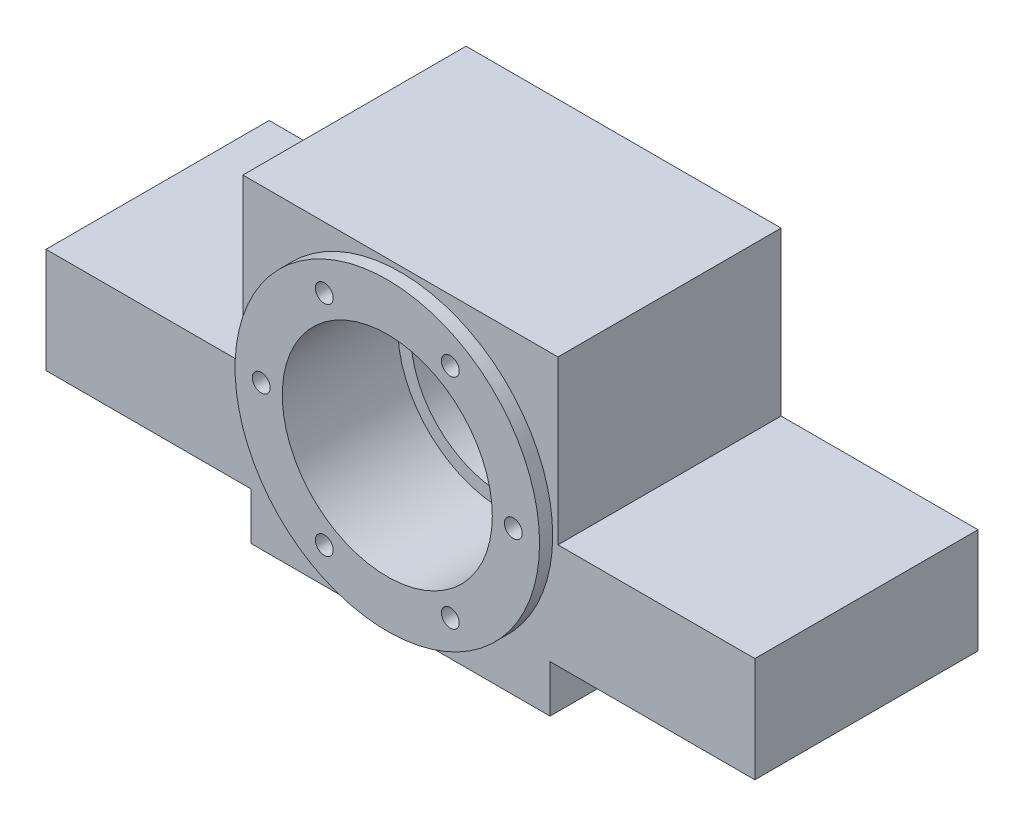
ISO-10303-21;
HEADER;
FILE_DESCRIPTION(('STEP AP214'),'2;1');
FILE_NAME('part.step','',(''),(''),'','','');
FILE_SCHEMA(('AUTOMOTIVE_DESIGN { 1 0 10303 214 1 1 1 1 }'));
ENDSEC;
DATA;
#1=APPLICATION_CONTEXT('core data for automotive mechanical design processes');
#2=APPLICATION_PROTOCOL_DEFINITION('international standard','automotive_design',2000,#1);
#3=PRODUCT_CONTEXT('',#1,'mechanical');
#4=PRODUCT('Part','Part','',(#3));
#5=PRODUCT_RELATED_PRODUCT_CATEGORY('part','',(#4));
#6=PRODUCT_DEFINITION_FORMATION('','',#4);
#7=PRODUCT_DEFINITION_CONTEXT('part definition',#1,'design');
#8=PRODUCT_DEFINITION('design','',#6,#7);
#9=PRODUCT_DEFINITION_SHAPE('','',#8);
#10=(LENGTH_UNIT() NAMED_UNIT(*) SI_UNIT(.MILLI.,.METRE.));
#11=(NAMED_UNIT(*) PLANE_ANGLE_UNIT() SI_UNIT($,.RADIAN.));
#12=(NAMED_UNIT(*) SI_UNIT($,.STERADIAN.) SOLID_ANGLE_UNIT());
#13=UNCERTAINTY_MEASURE_WITH_UNIT(LENGTH_MEASURE(1.E-05),#10,'distance_accuracy_value','');
#14=(GEOMETRIC_REPRESENTATION_CONTEXT(3) GLOBAL_UNCERTAINTY_ASSIGNED_CONTEXT((#13)) GLOBAL_UNIT_ASSIGNED_CONTEXT((#10,
#11,#12)) REPRESENTATION_CONTEXT('',''));
#15=CARTESIAN_POINT('',(0.,0.,0.));
#16=DIRECTION('',(0.,0.,1.));
#17=DIRECTION('',(1.,0.,0.));
#18=AXIS2_PLACEMENT_3D('',#15,#16,#17);
#19=CARTESIAN_POINT('',(60.,120.,-85.));
#20=DIRECTION('',(1.,0.,0.));
#21=DIRECTION('',(0.,1.,0.));
#22=AXIS2_PLACEMENT_3D('',#19,#20,#21);
#23=PLANE('',#22);
#24=DIRECTION('',(0.,1.,0.));
#25=VECTOR('',#24,1.);
#26=CARTESIAN_POINT('',(60.,120.,0.));
#27=LINE('',#26,#25);
#28=CARTESIAN_POINT('',(60.,58.,0.));
#29=VERTEX_POINT('',#28);
#30=CARTESIAN_POINT('',(60.,120.,0.));
#31=VERTEX_POINT('',#30);
#32=EDGE_CURVE('E171',#29,#31,#27,.T.);
#33=ORIENTED_EDGE('',*,*,#32,.F.);
#34=DIRECTION('',(0.,0.,1.));
#35=VECTOR('',#34,1.);
#36=CARTESIAN_POINT('',(60.,58.,-85.));
#37=LINE('',#36,#35);
#38=CARTESIAN_POINT('',(60.,58.,-85.));
#39=VERTEX_POINT('',#38);
#40=EDGE_CURVE('E54',#39,#29,#37,.T.);
#41=ORIENTED_EDGE('',*,*,#40,.F.);
#42=DIRECTION('',(0.,1.,0.));
#43=VECTOR('',#42,1.);
#44=CARTESIAN_POINT('',(60.,120.,-85.));
#45=LINE('',#44,#43);
#46=CARTESIAN_POINT('',(60.,120.,-85.));
#47=VERTEX_POINT('',#46);
#48=EDGE_CURVE('E205',#39,#47,#45,.T.);
#49=ORIENTED_EDGE('',*,*,#48,.T.);
#50=DIRECTION('',(0.,0.,1.));
#51=VECTOR('',#50,1.);
#52=CARTESIAN_POINT('',(60.,120.,-85.));
#53=LINE('',#52,#51);
#54=EDGE_CURVE('E48',#47,#31,#53,.T.);
#55=ORIENTED_EDGE('',*,*,#54,.T.);
#56=EDGE_LOOP('',(#33,#41,#49,#55));
#57=FACE_BOUND('',#56,.T.);
#58=ADVANCED_FACE('F45',(#57),#23,.T.);
#59=CARTESIAN_POINT('',(60.,58.,-85.));
#60=DIRECTION('',(0.,1.,0.));
#61=DIRECTION('',(-1.,0.,0.));
#62=AXIS2_PLACEMENT_3D('',#59,#60,#61);
#63=PLANE('',#62);
#64=DIRECTION('',(-1.,0.,0.));
#65=VECTOR('',#64,1.);
#66=CARTESIAN_POINT('',(60.,58.,0.));
#67=LINE('',#66,#65);
#68=CARTESIAN_POINT('',(135.,58.,0.));
#69=VERTEX_POINT('',#68);
#70=EDGE_CURVE('E202',#69,#29,#67,.T.);
#71=ORIENTED_EDGE('',*,*,#70,.F.);
#72=DIRECTION('',(0.,0.,1.));
#73=VECTOR('',#72,1.);
#74=CARTESIAN_POINT('',(135.,58.,-85.));
#75=LINE('',#74,#73);
#76=CARTESIAN_POINT('',(135.,58.,-85.));
#77=VERTEX_POINT('',#76);
#78=EDGE_CURVE('E104',#77,#69,#75,.T.);
#79=ORIENTED_EDGE('',*,*,#78,.F.);
#80=DIRECTION('',(-1.,0.,0.));
#81=VECTOR('',#80,1.);
#82=CARTESIAN_POINT('',(60.,58.,-85.));
#83=LINE('',#82,#81);
#84=EDGE_CURVE('E161',#77,#39,#83,.T.);
#85=ORIENTED_EDGE('',*,*,#84,.T.);
#86=ORIENTED_EDGE('',*,*,#40,.T.);
#87=EDGE_LOOP('',(#71,#79,#85,#86));
#88=FACE_BOUND('',#87,.T.);
#89=ADVANCED_FACE('F226',(#88),#63,.T.);
#90=CARTESIAN_POINT('',(135.,58.,-85.));
#91=DIRECTION('',(1.,0.,0.));
#92=DIRECTION('',(0.,0.,-1.));
#93=AXIS2_PLACEMENT_3D('',#90,#91,#92);
#94=PLANE('',#93);
#95=DIRECTION('',(0.,1.,0.));
#96=VECTOR('',#95,1.);
#97=CARTESIAN_POINT('',(135.,58.,0.));
#98=LINE('',#97,#96);
#99=CARTESIAN_POINT('',(135.,18.,0.));
#100=VERTEX_POINT('',#99);
#101=EDGE_CURVE('E148',#100,#69,#98,.T.);
#102=ORIENTED_EDGE('',*,*,#101,.F.);
#103=DIRECTION('',(0.,0.,1.));
#104=VECTOR('',#103,1.);
#105=CARTESIAN_POINT('',(135.,18.,-85.));
#106=LINE('',#105,#104);
#107=CARTESIAN_POINT('',(135.,18.,-85.));
#108=VERTEX_POINT('',#107);
#109=EDGE_CURVE('E143',#108,#100,#106,.T.);
#110=ORIENTED_EDGE('',*,*,#109,.F.);
#111=DIRECTION('',(0.,1.,0.));
#112=VECTOR('',#111,1.);
#113=CARTESIAN_POINT('',(135.,58.,-85.));
#114=LINE('',#113,#112);
#115=EDGE_CURVE('E146',#108,#77,#114,.T.);
#116=ORIENTED_EDGE('',*,*,#115,.T.);
#117=ORIENTED_EDGE('',*,*,#78,.T.);
#118=EDGE_LOOP('',(#102,#110,#116,#117));
#119=FACE_BOUND('',#118,.T.);
#120=ADVANCED_FACE('F145',(#119),#94,.T.);
#121=CARTESIAN_POINT('',(57.,18.,-85.));
#122=DIRECTION('',(0.,-1.,0.));
#123=DIRECTION('',(0.,0.,-1.));
#124=AXIS2_PLACEMENT_3D('',#121,#122,#123);
#125=PLANE('',#124);
#126=DIRECTION('',(1.,0.,0.));
#127=VECTOR('',#126,1.);
#128=CARTESIAN_POINT('',(57.,18.,0.));
#129=LINE('',#128,#127);
#130=CARTESIAN_POINT('',(57.,18.,0.));
#131=VERTEX_POINT('',#130);
#132=EDGE_CURVE('E199',#131,#100,#129,.T.);
#133=ORIENTED_EDGE('',*,*,#132,.F.);
#134=DIRECTION('',(0.,0.,1.));
#135=VECTOR('',#134,1.);
#136=CARTESIAN_POINT('',(57.,18.,-85.));
#137=LINE('',#136,#135);
#138=CARTESIAN_POINT('',(57.,18.,-85.));
#139=VERTEX_POINT('',#138);
#140=EDGE_CURVE('E153',#139,#131,#137,.T.);
#141=ORIENTED_EDGE('',*,*,#140,.F.);
#142=DIRECTION('',(1.,0.,0.));
#143=VECTOR('',#142,1.);
#144=CARTESIAN_POINT('',(57.,18.,-85.));
#145=LINE('',#144,#143);
#146=EDGE_CURVE('E159',#139,#108,#145,.T.);
#147=ORIENTED_EDGE('',*,*,#146,.T.);
#148=ORIENTED_EDGE('',*,*,#109,.T.);
#149=EDGE_LOOP('',(#133,#141,#147,#148));
#150=FACE_BOUND('',#149,.T.);
#151=ADVANCED_FACE('F163',(#150),#125,.T.);
#152=CARTESIAN_POINT('',(57.,0.,-85.));
#153=DIRECTION('',(1.,0.,0.));
#154=DIRECTION('',(0.,0.,-1.));
#155=AXIS2_PLACEMENT_3D('',#152,#153,#154);
#156=PLANE('',#155);
#157=DIRECTION('',(0.,1.,0.));
#158=VECTOR('',#157,1.);
#159=CARTESIAN_POINT('',(57.,0.,0.));
#160=LINE('',#159,#158);
#161=CARTESIAN_POINT('',(57.,0.,0.));
#162=VERTEX_POINT('',#161);
#163=EDGE_CURVE('E196',#162,#131,#160,.T.);
#164=ORIENTED_EDGE('',*,*,#163,.F.);
#165=DIRECTION('',(0.,0.,1.));
#166=VECTOR('',#165,1.);
#167=CARTESIAN_POINT('',(57.,0.,-85.));
#168=LINE('',#167,#166);
#169=CARTESIAN_POINT('',(57.,0.,-85.));
#170=VERTEX_POINT('',#169);
#171=EDGE_CURVE('E209',#170,#162,#168,.T.);
#172=ORIENTED_EDGE('',*,*,#171,.F.);
#173=DIRECTION('',(0.,1.,0.));
#174=VECTOR('',#173,1.);
#175=CARTESIAN_POINT('',(57.,0.,-85.));
#176=LINE('',#175,#174);
#177=EDGE_CURVE('E164',#170,#139,#176,.T.);
#178=ORIENTED_EDGE('',*,*,#177,.T.);
#179=ORIENTED_EDGE('',*,*,#140,.T.);
#180=EDGE_LOOP('',(#164,#172,#178,#179));
#181=FACE_BOUND('',#180,.T.);
#182=ADVANCED_FACE('F239',(#181),#156,.T.);
#183=CARTESIAN_POINT('',(0.,0.,-85.));
#184=DIRECTION('',(0.,-1.,0.));
#185=DIRECTION('',(0.,0.,-1.));
#186=AXIS2_PLACEMENT_3D('',#183,#184,#185);
#187=PLANE('',#186);
#188=DIRECTION('',(1.,0.,0.));
#189=VECTOR('',#188,1.);
#190=CARTESIAN_POINT('',(0.,0.,0.));
#191=LINE('',#190,#189);
#192=CARTESIAN_POINT('',(-57.,0.,0.));
#193=VERTEX_POINT('',#192);
#194=EDGE_CURVE('E193',#193,#162,#191,.T.);
#195=ORIENTED_EDGE('',*,*,#194,.F.);
#196=DIRECTION('',(0.,0.,1.));
#197=VECTOR('',#196,1.);
#198=CARTESIAN_POINT('',(-57.,0.,-85.));
#199=LINE('',#198,#197);
#200=CARTESIAN_POINT('',(-57.,0.,-85.));
#201=VERTEX_POINT('',#200);
#202=EDGE_CURVE('E211',#201,#193,#199,.T.);
#203=ORIENTED_EDGE('',*,*,#202,.F.);
#204=DIRECTION('',(1.,0.,0.));
#205=VECTOR('',#204,1.);
#206=CARTESIAN_POINT('',(0.,0.,-85.));
#207=LINE('',#206,#205);
#208=EDGE_CURVE('E166',#201,#170,#207,.T.);
#209=ORIENTED_EDGE('',*,*,#208,.T.);
#210=ORIENTED_EDGE('',*,*,#171,.T.);
#211=EDGE_LOOP('',(#195,#203,#209,#210));
#212=FACE_BOUND('',#211,.T.);
#213=ADVANCED_FACE('F242',(#212),#187,.T.);
#214=CARTESIAN_POINT('',(-57.,0.,-85.));
#215=DIRECTION('',(-1.,0.,0.));
#216=DIRECTION('',(0.,0.,1.));
#217=AXIS2_PLACEMENT_3D('',#214,#215,#216);
#218=PLANE('',#217);
#219=DIRECTION('',(0.,-1.,0.));
#220=VECTOR('',#219,1.);
#221=CARTESIAN_POINT('',(-57.,0.,0.));
#222=LINE('',#221,#220);
#223=CARTESIAN_POINT('',(-57.,18.,0.));
#224=VERTEX_POINT('',#223);
#225=EDGE_CURVE('E190',#224,#193,#222,.T.);
#226=ORIENTED_EDGE('',*,*,#225,.F.);
#227=DIRECTION('',(0.,0.,1.));
#228=VECTOR('',#227,1.);
#229=CARTESIAN_POINT('',(-57.,18.,-85.));
#230=LINE('',#229,#228);
#231=CARTESIAN_POINT('',(-57.,18.,-85.));
#232=VERTEX_POINT('',#231);
#233=EDGE_CURVE('E214',#232,#224,#230,.T.);
#234=ORIENTED_EDGE('',*,*,#233,.F.);
#235=DIRECTION('',(0.,-1.,0.));
#236=VECTOR('',#235,1.);
#237=CARTESIAN_POINT('',(-57.,0.,-85.));
#238=LINE('',#237,#236);
#239=EDGE_CURVE('E414',#232,#201,#238,.T.);
#240=ORIENTED_EDGE('',*,*,#239,.T.);
#241=ORIENTED_EDGE('',*,*,#202,.T.);
#242=EDGE_LOOP('',(#226,#234,#240,#241));
#243=FACE_BOUND('',#242,.T.);
#244=ADVANCED_FACE('F246',(#243),#218,.T.);
#245=CARTESIAN_POINT('',(-57.,18.,-85.));
#246=DIRECTION('',(0.,-1.,0.));
#247=DIRECTION('',(1.,0.,0.));
#248=AXIS2_PLACEMENT_3D('',#245,#246,#247);
#249=PLANE('',#248);
#250=DIRECTION('',(1.,0.,0.));
#251=VECTOR('',#250,1.);
#252=CARTESIAN_POINT('',(-57.,18.,0.));
#253=LINE('',#252,#251);
#254=CARTESIAN_POINT('',(-135.,18.,0.));
#255=VERTEX_POINT('',#254);
#256=EDGE_CURVE('E187',#255,#224,#253,.T.);
#257=ORIENTED_EDGE('',*,*,#256,.F.);
#258=DIRECTION('',(0.,0.,1.));
#259=VECTOR('',#258,1.);
#260=CARTESIAN_POINT('',(-135.,18.,-85.));
#261=LINE('',#260,#259);
#262=CARTESIAN_POINT('',(-135.,18.,-85.));
#263=VERTEX_POINT('',#262);
#264=EDGE_CURVE('E216',#263,#255,#261,.T.);
#265=ORIENTED_EDGE('',*,*,#264,.F.);
#266=DIRECTION('',(1.,0.,0.));
#267=VECTOR('',#266,1.);
#268=CARTESIAN_POINT('',(-57.,18.,-85.));
#269=LINE('',#268,#267);
#270=EDGE_CURVE('E411',#263,#232,#269,.T.);
#271=ORIENTED_EDGE('',*,*,#270,.T.);
#272=ORIENTED_EDGE('',*,*,#233,.T.);
#273=EDGE_LOOP('',(#257,#265,#271,#272));
#274=FACE_BOUND('',#273,.T.);
#275=ADVANCED_FACE('F250',(#274),#249,.T.);
#276=CARTESIAN_POINT('',(-135.,58.,-85.));
#277=DIRECTION('',(-1.,0.,0.));
#278=DIRECTION('',(0.,0.,1.));
#279=AXIS2_PLACEMENT_3D('',#276,#277,#278);
#280=PLANE('',#279);
#281=DIRECTION('',(0.,-1.,0.));
#282=VECTOR('',#281,1.);
#283=CARTESIAN_POINT('',(-135.,58.,0.));
#284=LINE('',#283,#282);
#285=CARTESIAN_POINT('',(-135.,58.,0.));
#286=VERTEX_POINT('',#285);
#287=EDGE_CURVE('E184',#286,#255,#284,.T.);
#288=ORIENTED_EDGE('',*,*,#287,.F.);
#289=DIRECTION('',(0.,0.,1.));
#290=VECTOR('',#289,1.);
#291=CARTESIAN_POINT('',(-135.,58.,-85.));
#292=LINE('',#291,#290);
#293=CARTESIAN_POINT('',(-135.,58.,-85.));
#294=VERTEX_POINT('',#293);
#295=EDGE_CURVE('E218',#294,#286,#292,.T.);
#296=ORIENTED_EDGE('',*,*,#295,.F.);
#297=DIRECTION('',(0.,-1.,0.));
#298=VECTOR('',#297,1.);
#299=CARTESIAN_POINT('',(-135.,58.,-85.));
#300=LINE('',#299,#298);
#301=EDGE_CURVE('E408',#294,#263,#300,.T.);
#302=ORIENTED_EDGE('',*,*,#301,.T.);
#303=ORIENTED_EDGE('',*,*,#264,.T.);
#304=EDGE_LOOP('',(#288,#296,#302,#303));
#305=FACE_BOUND('',#304,.T.);
#306=ADVANCED_FACE('F254',(#305),#280,.T.);
#307=CARTESIAN_POINT('',(-135.,58.,-85.));
#308=DIRECTION('',(0.,1.,0.));
#309=DIRECTION('',(-1.,0.,0.));
#310=AXIS2_PLACEMENT_3D('',#307,#308,#309);
#311=PLANE('',#310);
#312=DIRECTION('',(-1.,0.,0.));
#313=VECTOR('',#312,1.);
#314=CARTESIAN_POINT('',(-135.,58.,0.));
#315=LINE('',#314,#313);
#316=CARTESIAN_POINT('',(-60.,58.,0.));
#317=VERTEX_POINT('',#316);
#318=EDGE_CURVE('E181',#317,#286,#315,.T.);
#319=ORIENTED_EDGE('',*,*,#318,.F.);
#320=DIRECTION('',(0.,0.,1.));
#321=VECTOR('',#320,1.);
#322=CARTESIAN_POINT('',(-60.,58.,-85.));
#323=LINE('',#322,#321);
#324=CARTESIAN_POINT('',(-60.,58.,-85.));
#325=VERTEX_POINT('',#324);
#326=EDGE_CURVE('E220',#325,#317,#323,.T.);
#327=ORIENTED_EDGE('',*,*,#326,.F.);
#328=DIRECTION('',(-1.,0.,0.));
#329=VECTOR('',#328,1.);
#330=CARTESIAN_POINT('',(-135.,58.,-85.));
#331=LINE('',#330,#329);
#332=EDGE_CURVE('E405',#325,#294,#331,.T.);
#333=ORIENTED_EDGE('',*,*,#332,.T.);
#334=ORIENTED_EDGE('',*,*,#295,.T.);
#335=EDGE_LOOP('',(#319,#327,#333,#334));
#336=FACE_BOUND('',#335,.T.);
#337=ADVANCED_FACE('F258',(#336),#311,.T.);
#338=CARTESIAN_POINT('',(-60.,58.,-85.));
#339=DIRECTION('',(-1.,0.,0.));
#340=DIRECTION('',(0.,0.,1.));
#341=AXIS2_PLACEMENT_3D('',#338,#339,#340);
#342=PLANE('',#341);
#343=DIRECTION('',(0.,-1.,0.));
#344=VECTOR('',#343,1.);
#345=CARTESIAN_POINT('',(-60.,58.,0.));
#346=LINE('',#345,#344);
#347=CARTESIAN_POINT('',(-60.,120.,0.));
#348=VERTEX_POINT('',#347);
#349=EDGE_CURVE('E178',#348,#317,#346,.T.);
#350=ORIENTED_EDGE('',*,*,#349,.F.);
#351=DIRECTION('',(0.,0.,1.));
#352=VECTOR('',#351,1.);
#353=CARTESIAN_POINT('',(-60.,120.,-85.));
#354=LINE('',#353,#352);
#355=CARTESIAN_POINT('',(-60.,120.,-85.));
#356=VERTEX_POINT('',#355);
#357=EDGE_CURVE('E221',#356,#348,#354,.T.);
#358=ORIENTED_EDGE('',*,*,#357,.F.);
#359=DIRECTION('',(0.,-1.,0.));
#360=VECTOR('',#359,1.);
#361=CARTESIAN_POINT('',(-60.,58.,-85.));
#362=LINE('',#361,#360);
#363=EDGE_CURVE('E402',#356,#325,#362,.T.);
#364=ORIENTED_EDGE('',*,*,#363,.T.);
#365=ORIENTED_EDGE('',*,*,#326,.T.);
#366=EDGE_LOOP('',(#350,#358,#364,#365));
#367=FACE_BOUND('',#366,.T.);
#368=ADVANCED_FACE('F262',(#367),#342,.T.);
#369=CARTESIAN_POINT('',(-60.,120.,-85.));
#370=DIRECTION('',(0.,1.,0.));
#371=DIRECTION('',(0.,0.,1.));
#372=AXIS2_PLACEMENT_3D('',#369,#370,#371);
#373=PLANE('',#372);
#374=DIRECTION('',(-1.,0.,0.));
#375=VECTOR('',#374,1.);
#376=CARTESIAN_POINT('',(-60.,120.,0.));
#377=LINE('',#376,#375);
#378=EDGE_CURVE('E174',#31,#348,#377,.T.);
#379=ORIENTED_EDGE('',*,*,#378,.F.);
#380=ORIENTED_EDGE('',*,*,#54,.F.);
#381=DIRECTION('',(-1.,0.,0.));
#382=VECTOR('',#381,1.);
#383=CARTESIAN_POINT('',(-60.,120.,-85.));
#384=LINE('',#383,#382);
#385=EDGE_CURVE('E400',#47,#356,#384,.T.);
#386=ORIENTED_EDGE('',*,*,#385,.T.);
#387=ORIENTED_EDGE('',*,*,#357,.T.);
#388=EDGE_LOOP('',(#379,#380,#386,#387));
#389=FACE_BOUND('',#388,.T.);
#390=ADVANCED_FACE('F223',(#389),#373,.T.);
#391=CARTESIAN_POINT('',(0.,0.,-85.));
#392=DIRECTION('',(0.,0.,1.));
#393=DIRECTION('',(1.,0.,0.));
#394=AXIS2_PLACEMENT_3D('',#391,#392,#393);
#395=PLANE('',#394);
#396=CARTESIAN_POINT('',(0.,60.,-85.));
#397=DIRECTION('',(0.,0.,1.));
#398=DIRECTION('',(1.,0.,0.));
#399=AXIS2_PLACEMENT_3D('',#396,#397,#398);
#400=CIRCLE('',#399,35.);
#401=CARTESIAN_POINT('',(35.,60.,-85.));
#402=VERTEX_POINT('',#401);
#403=EDGE_CURVE('E387',#402,#402,#400,.T.);
#404=ORIENTED_EDGE('',*,*,#403,.T.);
#405=EDGE_LOOP('',(#404));
#406=FACE_BOUND('',#405,.T.);
#407=ORIENTED_EDGE('',*,*,#48,.F.);
#408=ORIENTED_EDGE('',*,*,#84,.F.);
#409=ORIENTED_EDGE('',*,*,#115,.F.);
#410=ORIENTED_EDGE('',*,*,#146,.F.);
#411=ORIENTED_EDGE('',*,*,#177,.F.);
#412=ORIENTED_EDGE('',*,*,#208,.F.);
#413=ORIENTED_EDGE('',*,*,#239,.F.);
#414=ORIENTED_EDGE('',*,*,#270,.F.);
#415=ORIENTED_EDGE('',*,*,#301,.F.);
#416=ORIENTED_EDGE('',*,*,#332,.F.);
#417=ORIENTED_EDGE('',*,*,#363,.F.);
#418=ORIENTED_EDGE('',*,*,#385,.F.);
#419=EDGE_LOOP('',(#407,#408,#409,#410,#411,#412,#413,#414,#415,#416,#417,#418));
#420=FACE_BOUND('',#419,.T.);
#421=ADVANCED_FACE('F157',(#406,#420),#395,.F.);
#422=CARTESIAN_POINT('',(0.,0.,0.));
#423=DIRECTION('',(0.,0.,1.));
#424=DIRECTION('',(1.,0.,0.));
#425=AXIS2_PLACEMENT_3D('',#422,#423,#424);
#426=PLANE('',#425);
#427=CARTESIAN_POINT('',(0.,60.,0.));
#428=DIRECTION('',(0.,0.,1.));
#429=DIRECTION('',(1.,0.,0.));
#430=AXIS2_PLACEMENT_3D('',#427,#428,#429);
#431=CIRCLE('',#430,58.);
#432=CARTESIAN_POINT('',(58.,60.,0.));
#433=VERTEX_POINT('',#432);
#434=EDGE_CURVE('E11',#433,#433,#431,.T.);
#435=ORIENTED_EDGE('',*,*,#434,.F.);
#436=EDGE_LOOP('',(#435));
#437=FACE_BOUND('',#436,.T.);
#438=ORIENTED_EDGE('',*,*,#32,.T.);
#439=ORIENTED_EDGE('',*,*,#378,.T.);
#440=ORIENTED_EDGE('',*,*,#349,.T.);
#441=ORIENTED_EDGE('',*,*,#318,.T.);
#442=ORIENTED_EDGE('',*,*,#287,.T.);
#443=ORIENTED_EDGE('',*,*,#256,.T.);
#444=ORIENTED_EDGE('',*,*,#225,.T.);
#445=ORIENTED_EDGE('',*,*,#194,.T.);
#446=ORIENTED_EDGE('',*,*,#163,.T.);
#447=ORIENTED_EDGE('',*,*,#132,.T.);
#448=ORIENTED_EDGE('',*,*,#101,.T.);
#449=ORIENTED_EDGE('',*,*,#70,.T.);
#450=EDGE_LOOP('',(#438,#439,#440,#441,#442,#443,#444,#445,#446,#447,#448,#449));
#451=FACE_BOUND('',#450,.T.);
#452=ADVANCED_FACE('F225',(#437,#451),#426,.T.);
#453=CARTESIAN_POINT('',(0.,60.,5.));
#454=DIRECTION('',(0.,0.,-1.));
#455=DIRECTION('',(-1.,0.,0.));
#456=AXIS2_PLACEMENT_3D('',#453,#454,#455);
#457=CYLINDRICAL_SURFACE('',#456,58.);
#458=CARTESIAN_POINT('',(0.,60.,5.));
#459=DIRECTION('',(0.,0.,1.));
#460=DIRECTION('',(1.,0.,0.));
#461=AXIS2_PLACEMENT_3D('',#458,#459,#460);
#462=CIRCLE('',#461,58.);
#463=CARTESIAN_POINT('',(58.,60.,5.));
#464=VERTEX_POINT('',#463);
#465=EDGE_CURVE('E175',#464,#464,#462,.T.);
#466=ORIENTED_EDGE('',*,*,#465,.F.);
#467=EDGE_LOOP('',(#466));
#468=FACE_BOUND('',#467,.T.);
#469=ORIENTED_EDGE('',*,*,#434,.T.);
#470=EDGE_LOOP('',(#469));
#471=FACE_BOUND('',#470,.T.);
#472=ADVANCED_FACE('F276',(#468,#471),#457,.T.);
#473=CARTESIAN_POINT('',(0.,60.,5.));
#474=DIRECTION('',(0.,0.,1.));
#475=DIRECTION('',(1.,0.,0.));
#476=AXIS2_PLACEMENT_3D('',#473,#474,#475);
#477=PLANE('',#476);
#478=CARTESIAN_POINT('',(48.,60.0000000000006,5.));
#479=DIRECTION('',(0.,0.,1.));
#480=DIRECTION('',(1.,0.,0.));
#481=AXIS2_PLACEMENT_3D('',#478,#479,#480);
#482=CIRCLE('',#481,3.39999999999999);
#483=CARTESIAN_POINT('',(51.4,60.0000000000006,5.));
#484=VERTEX_POINT('',#483);
#485=EDGE_CURVE('E352',#484,#484,#482,.T.);
#486=ORIENTED_EDGE('',*,*,#485,.F.);
#487=EDGE_LOOP('',(#486));
#488=FACE_BOUND('',#487,.T.);
#489=CARTESIAN_POINT('',(24.0000000000004,18.4307806183472,5.));
#490=DIRECTION('',(0.,0.,1.));
#491=DIRECTION('',(1.,0.,0.));
#492=AXIS2_PLACEMENT_3D('',#489,#490,#491);
#493=CIRCLE('',#492,3.39999999999999);
#494=CARTESIAN_POINT('',(27.4000000000004,18.4307806183472,5.));
#495=VERTEX_POINT('',#494);
#496=EDGE_CURVE('E354',#495,#495,#493,.T.);
#497=ORIENTED_EDGE('',*,*,#496,.F.);
#498=EDGE_LOOP('',(#497));
#499=FACE_BOUND('',#498,.T.);
#500=CARTESIAN_POINT('',(-24.,18.4307806183469,5.));
#501=DIRECTION('',(0.,0.,1.));
#502=DIRECTION('',(1.,0.,0.));
#503=AXIS2_PLACEMENT_3D('',#500,#501,#502);
#504=CIRCLE('',#503,3.39999999999999);
#505=CARTESIAN_POINT('',(-20.6,18.4307806183469,5.));
#506=VERTEX_POINT('',#505);
#507=EDGE_CURVE('E362',#506,#506,#504,.T.);
#508=ORIENTED_EDGE('',*,*,#507,.F.);
#509=EDGE_LOOP('',(#508));
#510=FACE_BOUND('',#509,.T.);
#511=CARTESIAN_POINT('',(-48.,59.9999999999998,5.));
#512=DIRECTION('',(0.,0.,1.));
#513=DIRECTION('',(1.,0.,0.));
#514=AXIS2_PLACEMENT_3D('',#511,#512,#513);
#515=CIRCLE('',#514,3.39999999999999);
#516=CARTESIAN_POINT('',(-44.6,59.9999999999998,5.));
#517=VERTEX_POINT('',#516);
#518=EDGE_CURVE('E368',#517,#517,#515,.T.);
#519=ORIENTED_EDGE('',*,*,#518,.F.);
#520=EDGE_LOOP('',(#519));
#521=FACE_BOUND('',#520,.T.);
#522=CARTESIAN_POINT('',(-24.0000000000001,101.569219381653,5.));
#523=DIRECTION('',(0.,0.,1.));
#524=DIRECTION('',(1.,0.,0.));
#525=AXIS2_PLACEMENT_3D('',#522,#523,#524);
#526=CIRCLE('',#525,3.39999999999999);
#527=CARTESIAN_POINT('',(-20.6000000000001,101.569219381653,5.));
#528=VERTEX_POINT('',#527);
#529=EDGE_CURVE('E374',#528,#528,#526,.T.);
#530=ORIENTED_EDGE('',*,*,#529,.F.);
#531=EDGE_LOOP('',(#530));
#532=FACE_BOUND('',#531,.T.);
#533=CARTESIAN_POINT('',(24.,101.569219381653,5.));
#534=DIRECTION('',(0.,0.,1.));
#535=DIRECTION('',(1.,0.,0.));
#536=AXIS2_PLACEMENT_3D('',#533,#534,#535);
#537=CIRCLE('',#536,3.39999999999999);
#538=CARTESIAN_POINT('',(27.4,101.569219381653,5.));
#539=VERTEX_POINT('',#538);
#540=EDGE_CURVE('E380',#539,#539,#537,.T.);
#541=ORIENTED_EDGE('',*,*,#540,.F.);
#542=EDGE_LOOP('',(#541));
#543=FACE_BOUND('',#542,.T.);
#544=CARTESIAN_POINT('',(0.,60.,5.));
#545=DIRECTION('',(0.,0.,1.));
#546=DIRECTION('',(1.,0.,0.));
#547=AXIS2_PLACEMENT_3D('',#544,#545,#546);
#548=CIRCLE('',#547,40.);
#549=CARTESIAN_POINT('',(40.,60.,5.));
#550=VERTEX_POINT('',#549);
#551=EDGE_CURVE('E389',#550,#550,#548,.T.);
#552=ORIENTED_EDGE('',*,*,#551,.F.);
#553=EDGE_LOOP('',(#552));
#554=FACE_BOUND('',#553,.T.);
#555=ORIENTED_EDGE('',*,*,#465,.T.);
#556=EDGE_LOOP('',(#555));
#557=FACE_BOUND('',#556,.T.);
#558=ADVANCED_FACE('F282',(#488,#499,#510,#521,#532,#543,#554,#557),#477,.T.);
#559=CARTESIAN_POINT('',(0.,60.,-39.));
#560=DIRECTION('',(0.,0.,1.));
#561=DIRECTION('',(1.,0.,0.));
#562=AXIS2_PLACEMENT_3D('',#559,#560,#561);
#563=CYLINDRICAL_SURFACE('',#562,40.);
#564=CARTESIAN_POINT('',(0.,60.,-39.));
#565=DIRECTION('',(0.,0.,1.));
#566=DIRECTION('',(1.,0.,0.));
#567=AXIS2_PLACEMENT_3D('',#564,#565,#566);
#568=CIRCLE('',#567,40.);
#569=CARTESIAN_POINT('',(40.,60.,-39.));
#570=VERTEX_POINT('',#569);
#571=EDGE_CURVE('E392',#570,#570,#568,.T.);
#572=ORIENTED_EDGE('',*,*,#571,.F.);
#573=EDGE_LOOP('',(#572));
#574=FACE_BOUND('',#573,.T.);
#575=ORIENTED_EDGE('',*,*,#551,.T.);
#576=EDGE_LOOP('',(#575));
#577=FACE_BOUND('',#576,.T.);
#578=ADVANCED_FACE('F286',(#574,#577),#563,.F.);
#579=CARTESIAN_POINT('',(0.,60.,-39.));
#580=DIRECTION('',(0.,0.,1.));
#581=DIRECTION('',(1.,0.,0.));
#582=AXIS2_PLACEMENT_3D('',#579,#580,#581);
#583=PLANE('',#582);
#584=CARTESIAN_POINT('',(0.,60.,-39.));
#585=DIRECTION('',(0.,0.,1.));
#586=DIRECTION('',(1.,0.,0.));
#587=AXIS2_PLACEMENT_3D('',#584,#585,#586);
#588=CIRCLE('',#587,35.);
#589=CARTESIAN_POINT('',(35.,60.,-39.));
#590=VERTEX_POINT('',#589);
#591=EDGE_CURVE('E386',#590,#590,#588,.T.);
#592=ORIENTED_EDGE('',*,*,#591,.F.);
#593=EDGE_LOOP('',(#592));
#594=FACE_BOUND('',#593,.T.);
#595=ORIENTED_EDGE('',*,*,#571,.T.);
#596=EDGE_LOOP('',(#595));
#597=FACE_BOUND('',#596,.T.);
#598=ADVANCED_FACE('F289',(#594,#597),#583,.T.);
#599=CARTESIAN_POINT('',(0.,60.,-85.));
#600=DIRECTION('',(0.,0.,1.));
#601=DIRECTION('',(1.,0.,0.));
#602=AXIS2_PLACEMENT_3D('',#599,#600,#601);
#603=CYLINDRICAL_SURFACE('',#602,35.);
#604=ORIENTED_EDGE('',*,*,#403,.F.);
#605=EDGE_LOOP('',(#604));
#606=FACE_BOUND('',#605,.T.);
#607=ORIENTED_EDGE('',*,*,#591,.T.);
#608=EDGE_LOOP('',(#607));
#609=FACE_BOUND('',#608,.T.);
#610=ADVANCED_FACE('F292',(#606,#609),#603,.F.);
#611=CARTESIAN_POINT('',(24.,101.569219381653,-22.76));
#612=DIRECTION('',(0.,0.,1.));
#613=DIRECTION('',(1.,0.,0.));
#614=AXIS2_PLACEMENT_3D('',#611,#612,#613);
#615=CONICAL_SURFACE('',#614,3.39999999999999,1.02974425867665);
#616=CARTESIAN_POINT('',(24.,101.569219381653,-24.8029261046937));
#617=VERTEX_POINT('',#616);
#618=VERTEX_LOOP('',#617);
#619=FACE_BOUND('',#618,.T.);
#620=CARTESIAN_POINT('',(24.,101.569219381653,-22.76));
#621=DIRECTION('',(0.,0.,1.));
#622=DIRECTION('',(1.,0.,0.));
#623=AXIS2_PLACEMENT_3D('',#620,#621,#622);
#624=CIRCLE('',#623,3.39999999999999);
#625=CARTESIAN_POINT('',(27.4,101.569219381653,-22.76));
#626=VERTEX_POINT('',#625);
#627=EDGE_CURVE('E383',#626,#626,#624,.T.);
#628=ORIENTED_EDGE('',*,*,#627,.T.);
#629=EDGE_LOOP('',(#628));
#630=FACE_BOUND('',#629,.T.);
#631=ADVANCED_FACE('F296',(#619,#630),#615,.F.);
#632=CARTESIAN_POINT('',(24.,101.569219381653,5.));
#633=DIRECTION('',(0.,0.,1.));
#634=DIRECTION('',(1.,0.,0.));
#635=AXIS2_PLACEMENT_3D('',#632,#633,#634);
#636=CYLINDRICAL_SURFACE('',#635,3.39999999999999);
#637=ORIENTED_EDGE('',*,*,#627,.F.);
#638=EDGE_LOOP('',(#637));
#639=FACE_BOUND('',#638,.T.);
#640=ORIENTED_EDGE('',*,*,#540,.T.);
#641=EDGE_LOOP('',(#640));
#642=FACE_BOUND('',#641,.T.);
#643=ADVANCED_FACE('F300',(#639,#642),#636,.F.);
#644=CARTESIAN_POINT('',(-24.0000000000001,101.569219381653,-22.76));
#645=DIRECTION('',(0.,0.,1.));
#646=DIRECTION('',(1.,0.,0.));
#647=AXIS2_PLACEMENT_3D('',#644,#645,#646);
#648=CONICAL_SURFACE('',#647,3.39999999999999,1.02974425867665);
#649=CARTESIAN_POINT('',(-24.0000000000001,101.569219381653,-24.8029261046937));
#650=VERTEX_POINT('',#649);
#651=VERTEX_LOOP('',#650);
#652=FACE_BOUND('',#651,.T.);
#653=CARTESIAN_POINT('',(-24.0000000000001,101.569219381653,-22.76));
#654=DIRECTION('',(0.,0.,1.));
#655=DIRECTION('',(1.,0.,0.));
#656=AXIS2_PLACEMENT_3D('',#653,#654,#655);
#657=CIRCLE('',#656,3.39999999999999);
#658=CARTESIAN_POINT('',(-20.6000000000001,101.569219381653,-22.76));
#659=VERTEX_POINT('',#658);
#660=EDGE_CURVE('E377',#659,#659,#657,.T.);
#661=ORIENTED_EDGE('',*,*,#660,.T.);
#662=EDGE_LOOP('',(#661));
#663=FACE_BOUND('',#662,.T.);
#664=ADVANCED_FACE('F304',(#652,#663),#648,.F.);
#665=CARTESIAN_POINT('',(-24.0000000000001,101.569219381653,5.));
#666=DIRECTION('',(0.,0.,1.));
#667=DIRECTION('',(1.,0.,0.));
#668=AXIS2_PLACEMENT_3D('',#665,#666,#667);
#669=CYLINDRICAL_SURFACE('',#668,3.39999999999999);
#670=ORIENTED_EDGE('',*,*,#660,.F.);
#671=EDGE_LOOP('',(#670));
#672=FACE_BOUND('',#671,.T.);
#673=ORIENTED_EDGE('',*,*,#529,.T.);
#674=EDGE_LOOP('',(#673));
#675=FACE_BOUND('',#674,.T.);
#676=ADVANCED_FACE('F308',(#672,#675),#669,.F.);
#677=CARTESIAN_POINT('',(-48.,59.9999999999998,-22.76));
#678=DIRECTION('',(0.,0.,1.));
#679=DIRECTION('',(1.,0.,0.));
#680=AXIS2_PLACEMENT_3D('',#677,#678,#679);
#681=CONICAL_SURFACE('',#680,3.39999999999999,1.02974425867665);
#682=CARTESIAN_POINT('',(-48.,59.9999999999998,-24.8029261046937));
#683=VERTEX_POINT('',#682);
#684=VERTEX_LOOP('',#683);
#685=FACE_BOUND('',#684,.T.);
#686=CARTESIAN_POINT('',(-48.,59.9999999999998,-22.76));
#687=DIRECTION('',(0.,0.,1.));
#688=DIRECTION('',(1.,0.,0.));
#689=AXIS2_PLACEMENT_3D('',#686,#687,#688);
#690=CIRCLE('',#689,3.39999999999999);
#691=CARTESIAN_POINT('',(-44.6,59.9999999999998,-22.76));
#692=VERTEX_POINT('',#691);
#693=EDGE_CURVE('E371',#692,#692,#690,.T.);
#694=ORIENTED_EDGE('',*,*,#693,.T.);
#695=EDGE_LOOP('',(#694));
#696=FACE_BOUND('',#695,.T.);
#697=ADVANCED_FACE('F312',(#685,#696),#681,.F.);
#698=CARTESIAN_POINT('',(-48.,59.9999999999998,5.));
#699=DIRECTION('',(0.,0.,1.));
#700=DIRECTION('',(1.,0.,0.));
#701=AXIS2_PLACEMENT_3D('',#698,#699,#700);
#702=CYLINDRICAL_SURFACE('',#701,3.39999999999999);
#703=ORIENTED_EDGE('',*,*,#693,.F.);
#704=EDGE_LOOP('',(#703));
#705=FACE_BOUND('',#704,.T.);
#706=ORIENTED_EDGE('',*,*,#518,.T.);
#707=EDGE_LOOP('',(#706));
#708=FACE_BOUND('',#707,.T.);
#709=ADVANCED_FACE('F316',(#705,#708),#702,.F.);
#710=CARTESIAN_POINT('',(-24.,18.4307806183469,-22.76));
#711=DIRECTION('',(0.,0.,1.));
#712=DIRECTION('',(1.,0.,0.));
#713=AXIS2_PLACEMENT_3D('',#710,#711,#712);
#714=CONICAL_SURFACE('',#713,3.39999999999999,1.02974425867665);
#715=CARTESIAN_POINT('',(-24.,18.4307806183469,-24.8029261046937));
#716=VERTEX_POINT('',#715);
#717=VERTEX_LOOP('',#716);
#718=FACE_BOUND('',#717,.T.);
#719=CARTESIAN_POINT('',(-24.,18.4307806183469,-22.76));
#720=DIRECTION('',(0.,0.,1.));
#721=DIRECTION('',(1.,0.,0.));
#722=AXIS2_PLACEMENT_3D('',#719,#720,#721);
#723=CIRCLE('',#722,3.39999999999999);
#724=CARTESIAN_POINT('',(-20.6,18.4307806183469,-22.76));
#725=VERTEX_POINT('',#724);
#726=EDGE_CURVE('E365',#725,#725,#723,.T.);
#727=ORIENTED_EDGE('',*,*,#726,.T.);
#728=EDGE_LOOP('',(#727));
#729=FACE_BOUND('',#728,.T.);
#730=ADVANCED_FACE('F320',(#718,#729),#714,.F.);
#731=CARTESIAN_POINT('',(-24.,18.4307806183469,5.));
#732=DIRECTION('',(0.,0.,1.));
#733=DIRECTION('',(1.,0.,0.));
#734=AXIS2_PLACEMENT_3D('',#731,#732,#733);
#735=CYLINDRICAL_SURFACE('',#734,3.39999999999999);
#736=ORIENTED_EDGE('',*,*,#726,.F.);
#737=EDGE_LOOP('',(#736));
#738=FACE_BOUND('',#737,.T.);
#739=ORIENTED_EDGE('',*,*,#507,.T.);
#740=EDGE_LOOP('',(#739));
#741=FACE_BOUND('',#740,.T.);
#742=ADVANCED_FACE('F324',(#738,#741),#735,.F.);
#743=CARTESIAN_POINT('',(24.0000000000004,18.4307806183472,-22.76));
#744=DIRECTION('',(0.,0.,1.));
#745=DIRECTION('',(1.,0.,0.));
#746=AXIS2_PLACEMENT_3D('',#743,#744,#745);
#747=CONICAL_SURFACE('',#746,3.39999999999999,1.02974425867665);
#748=CARTESIAN_POINT('',(24.0000000000004,18.4307806183472,-24.8029261046937));
#749=VERTEX_POINT('',#748);
#750=VERTEX_LOOP('',#749);
#751=FACE_BOUND('',#750,.T.);
#752=CARTESIAN_POINT('',(24.0000000000004,18.4307806183472,-22.76));
#753=DIRECTION('',(0.,0.,1.));
#754=DIRECTION('',(1.,0.,0.));
#755=AXIS2_PLACEMENT_3D('',#752,#753,#754);
#756=CIRCLE('',#755,3.39999999999999);
#757=CARTESIAN_POINT('',(27.4000000000004,18.4307806183472,-22.76));
#758=VERTEX_POINT('',#757);
#759=EDGE_CURVE('E359',#758,#758,#756,.T.);
#760=ORIENTED_EDGE('',*,*,#759,.T.);
#761=EDGE_LOOP('',(#760));
#762=FACE_BOUND('',#761,.T.);
#763=ADVANCED_FACE('F328',(#751,#762),#747,.F.);
#764=CARTESIAN_POINT('',(24.0000000000004,18.4307806183472,5.));
#765=DIRECTION('',(0.,0.,1.));
#766=DIRECTION('',(1.,0.,0.));
#767=AXIS2_PLACEMENT_3D('',#764,#765,#766);
#768=CYLINDRICAL_SURFACE('',#767,3.39999999999999);
#769=ORIENTED_EDGE('',*,*,#759,.F.);
#770=EDGE_LOOP('',(#769));
#771=FACE_BOUND('',#770,.T.);
#772=ORIENTED_EDGE('',*,*,#496,.T.);
#773=EDGE_LOOP('',(#772));
#774=FACE_BOUND('',#773,.T.);
#775=ADVANCED_FACE('F332',(#771,#774),#768,.F.);
#776=CARTESIAN_POINT('',(48.,60.0000000000006,-22.76));
#777=DIRECTION('',(0.,0.,1.));
#778=DIRECTION('',(1.,0.,0.));
#779=AXIS2_PLACEMENT_3D('',#776,#777,#778);
#780=CONICAL_SURFACE('',#779,3.39999999999999,1.02974425867665);
#781=CARTESIAN_POINT('',(48.,60.0000000000006,-24.8029261046937));
#782=VERTEX_POINT('',#781);
#783=VERTEX_LOOP('',#782);
#784=FACE_BOUND('',#783,.T.);
#785=CARTESIAN_POINT('',(48.,60.0000000000006,-22.76));
#786=DIRECTION('',(0.,0.,1.));
#787=DIRECTION('',(1.,0.,0.));
#788=AXIS2_PLACEMENT_3D('',#785,#786,#787);
#789=CIRCLE('',#788,3.39999999999999);
#790=CARTESIAN_POINT('',(51.4,60.0000000000006,-22.76));
#791=VERTEX_POINT('',#790);
#792=EDGE_CURVE('E349',#791,#791,#789,.T.);
#793=ORIENTED_EDGE('',*,*,#792,.T.);
#794=EDGE_LOOP('',(#793));
#795=FACE_BOUND('',#794,.T.);
#796=ADVANCED_FACE('F336',(#784,#795),#780,.F.);
#797=CARTESIAN_POINT('',(48.,60.0000000000006,5.));
#798=DIRECTION('',(0.,0.,1.));
#799=DIRECTION('',(1.,0.,0.));
#800=AXIS2_PLACEMENT_3D('',#797,#798,#799);
#801=CYLINDRICAL_SURFACE('',#800,3.39999999999999);
#802=ORIENTED_EDGE('',*,*,#792,.F.);
#803=EDGE_LOOP('',(#802));
#804=FACE_BOUND('',#803,.T.);
#805=ORIENTED_EDGE('',*,*,#485,.T.);
#806=EDGE_LOOP('',(#805));
#807=FACE_BOUND('',#806,.T.);
#808=ADVANCED_FACE('F340',(#804,#807),#801,.F.);
#809=CLOSED_SHELL('',(#58,#89,#120,#151,#182,#213,#244,#275,#306,#337,#368,#390,#421,#452,#472,
#558,#578,#598,#610,#631,#643,#664,#676,#697,#709,#730,#742,#763,#775,#796,#808));
#810=MANIFOLD_SOLID_BREP('B2',#809);
#811=ADVANCED_BREP_SHAPE_REPRESENTATION('',(#18,#810),#14);
#812=SHAPE_DEFINITION_REPRESENTATION(#9,#811);
ENDSEC;
END-ISO-10303-21;
